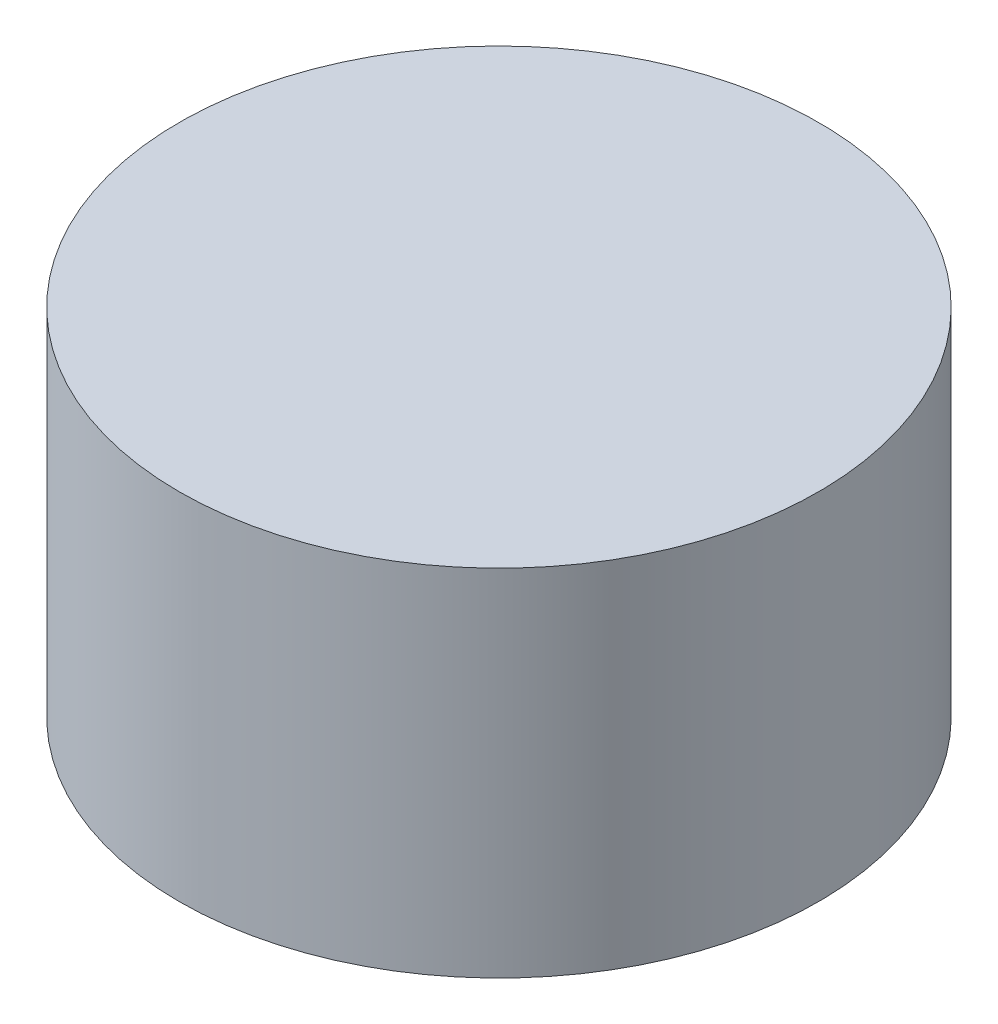
ISO-10303-21;
HEADER;
FILE_DESCRIPTION(('STEP AP214'),'2;1');
FILE_NAME('part.step','',(''),(''),'','','');
FILE_SCHEMA(('AUTOMOTIVE_DESIGN { 1 0 10303 214 1 1 1 1 }'));
ENDSEC;
DATA;
#1=APPLICATION_CONTEXT('core data for automotive mechanical design processes');
#2=APPLICATION_PROTOCOL_DEFINITION('international standard','automotive_design',2000,#1);
#3=PRODUCT_CONTEXT('',#1,'mechanical');
#4=PRODUCT('Part','Part','',(#3));
#5=PRODUCT_RELATED_PRODUCT_CATEGORY('part','',(#4));
#6=PRODUCT_DEFINITION_FORMATION('','',#4);
#7=PRODUCT_DEFINITION_CONTEXT('part definition',#1,'design');
#8=PRODUCT_DEFINITION('design','',#6,#7);
#9=PRODUCT_DEFINITION_SHAPE('','',#8);
#10=(LENGTH_UNIT() NAMED_UNIT(*) SI_UNIT(.MILLI.,.METRE.));
#11=(NAMED_UNIT(*) PLANE_ANGLE_UNIT() SI_UNIT($,.RADIAN.));
#12=(NAMED_UNIT(*) SI_UNIT($,.STERADIAN.) SOLID_ANGLE_UNIT());
#13=UNCERTAINTY_MEASURE_WITH_UNIT(LENGTH_MEASURE(1.E-05),#10,'distance_accuracy_value','');
#14=(GEOMETRIC_REPRESENTATION_CONTEXT(3) GLOBAL_UNCERTAINTY_ASSIGNED_CONTEXT((#13)) GLOBAL_UNIT_ASSIGNED_CONTEXT((#10,
#11,#12)) REPRESENTATION_CONTEXT('',''));
#15=CARTESIAN_POINT('',(0.,0.,0.));
#16=DIRECTION('',(0.,0.,1.));
#17=DIRECTION('',(1.,0.,0.));
#18=AXIS2_PLACEMENT_3D('',#15,#16,#17);
#19=CARTESIAN_POINT('',(0.,3.33,0.));
#20=DIRECTION('',(0.,-1.,0.));
#21=DIRECTION('',(0.,0.,-1.));
#22=AXIS2_PLACEMENT_3D('',#19,#20,#21);
#23=CYLINDRICAL_SURFACE('',#22,3.);
#24=CARTESIAN_POINT('',(0.,3.33,0.));
#25=DIRECTION('',(0.,1.,0.));
#26=DIRECTION('',(0.,0.,1.));
#27=AXIS2_PLACEMENT_3D('',#24,#25,#26);
#28=CIRCLE('',#27,3.);
#29=CARTESIAN_POINT('',(0.,3.33,3.));
#30=VERTEX_POINT('',#29);
#31=EDGE_CURVE('E10',#30,#30,#28,.T.);
#32=ORIENTED_EDGE('',*,*,#31,.F.);
#33=EDGE_LOOP('',(#32));
#34=FACE_BOUND('',#33,.T.);
#35=CARTESIAN_POINT('',(0.,0.,0.));
#36=DIRECTION('',(0.,1.,0.));
#37=DIRECTION('',(0.,0.,1.));
#38=AXIS2_PLACEMENT_3D('',#35,#36,#37);
#39=CIRCLE('',#38,3.);
#40=CARTESIAN_POINT('',(0.,0.,3.));
#41=VERTEX_POINT('',#40);
#42=EDGE_CURVE('E33',#41,#41,#39,.T.);
#43=ORIENTED_EDGE('',*,*,#42,.T.);
#44=EDGE_LOOP('',(#43));
#45=FACE_BOUND('',#44,.T.);
#46=ADVANCED_FACE('F30',(#34,#45),#23,.T.);
#47=CARTESIAN_POINT('',(0.,3.33,0.));
#48=DIRECTION('',(0.,1.,0.));
#49=DIRECTION('',(0.,0.,1.));
#50=AXIS2_PLACEMENT_3D('',#47,#48,#49);
#51=PLANE('',#50);
#52=ORIENTED_EDGE('',*,*,#31,.T.);
#53=EDGE_LOOP('',(#52));
#54=FACE_BOUND('',#53,.T.);
#55=ADVANCED_FACE('F45',(#54),#51,.T.);
#56=CARTESIAN_POINT('',(0.,0.,0.));
#57=DIRECTION('',(0.,1.,0.));
#58=DIRECTION('',(0.,0.,1.));
#59=AXIS2_PLACEMENT_3D('',#56,#57,#58);
#60=PLANE('',#59);
#61=ORIENTED_EDGE('',*,*,#42,.F.);
#62=EDGE_LOOP('',(#61));
#63=FACE_BOUND('',#62,.T.);
#64=ADVANCED_FACE('F43',(#63),#60,.F.);
#65=CLOSED_SHELL('',(#46,#55,#64));
#66=MANIFOLD_SOLID_BREP('B2',#65);
#67=ADVANCED_BREP_SHAPE_REPRESENTATION('',(#18,#66),#14);
#68=SHAPE_DEFINITION_REPRESENTATION(#9,#67);
ENDSEC;
END-ISO-10303-21;
